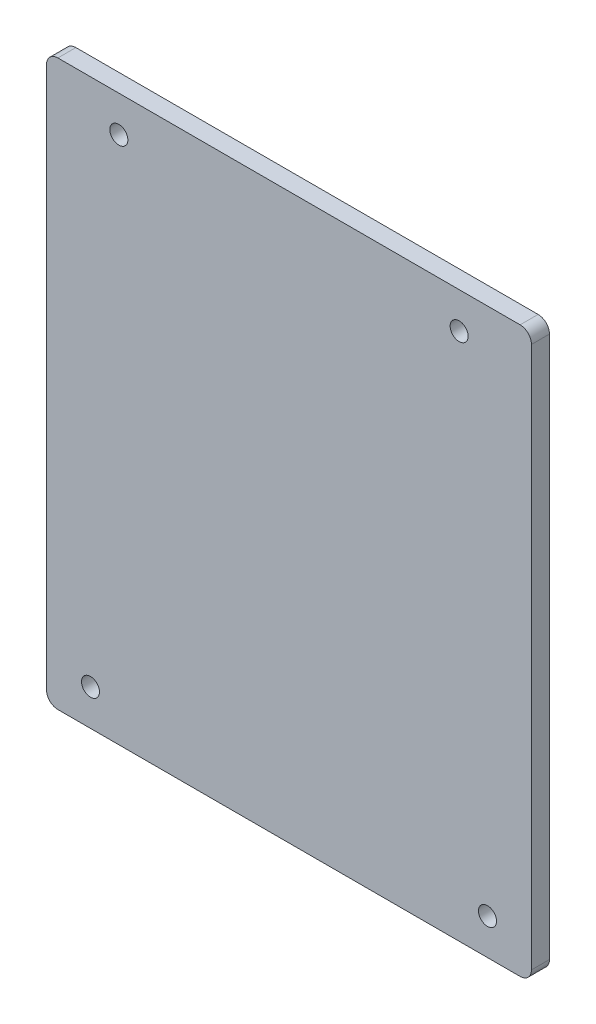
ISO-10303-21;
HEADER;
FILE_DESCRIPTION(('STEP AP214'),'2;1');
FILE_NAME('part.step','',(''),(''),'','','');
FILE_SCHEMA(('AUTOMOTIVE_DESIGN { 1 0 10303 214 1 1 1 1 }'));
ENDSEC;
DATA;
#1=APPLICATION_CONTEXT('core data for automotive mechanical design processes');
#2=APPLICATION_PROTOCOL_DEFINITION('international standard','automotive_design',2000,#1);
#3=PRODUCT_CONTEXT('',#1,'mechanical');
#4=PRODUCT('Part','Part','',(#3));
#5=PRODUCT_RELATED_PRODUCT_CATEGORY('part','',(#4));
#6=PRODUCT_DEFINITION_FORMATION('','',#4);
#7=PRODUCT_DEFINITION_CONTEXT('part definition',#1,'design');
#8=PRODUCT_DEFINITION('design','',#6,#7);
#9=PRODUCT_DEFINITION_SHAPE('','',#8);
#10=(LENGTH_UNIT() NAMED_UNIT(*) SI_UNIT(.MILLI.,.METRE.));
#11=(NAMED_UNIT(*) PLANE_ANGLE_UNIT() SI_UNIT($,.RADIAN.));
#12=(NAMED_UNIT(*) SI_UNIT($,.STERADIAN.) SOLID_ANGLE_UNIT());
#13=UNCERTAINTY_MEASURE_WITH_UNIT(LENGTH_MEASURE(1.E-05),#10,'distance_accuracy_value','');
#14=(GEOMETRIC_REPRESENTATION_CONTEXT(3) GLOBAL_UNCERTAINTY_ASSIGNED_CONTEXT((#13)) GLOBAL_UNIT_ASSIGNED_CONTEXT((#10,
#11,#12)) REPRESENTATION_CONTEXT('',''));
#15=CARTESIAN_POINT('',(0.,0.,0.));
#16=DIRECTION('',(0.,0.,1.));
#17=DIRECTION('',(1.,0.,0.));
#18=AXIS2_PLACEMENT_3D('',#15,#16,#17);
#19=CARTESIAN_POINT('',(40.75,-97.5,3.175));
#20=DIRECTION('',(0.,0.,1.));
#21=DIRECTION('',(1.,0.,0.));
#22=AXIS2_PLACEMENT_3D('',#19,#20,#21);
#23=PLANE('',#22);
#24=CARTESIAN_POINT('',(35.,-93.15,3.175));
#25=DIRECTION('',(0.,0.,1.));
#26=DIRECTION('',(1.,0.,0.));
#27=AXIS2_PLACEMENT_3D('',#24,#25,#26);
#28=CIRCLE('',#27,1.5875);
#29=CARTESIAN_POINT('',(36.5875,-93.15,3.175));
#30=VERTEX_POINT('',#29);
#31=EDGE_CURVE('E188',#30,#30,#28,.T.);
#32=ORIENTED_EDGE('',*,*,#31,.F.);
#33=EDGE_LOOP('',(#32));
#34=FACE_BOUND('',#33,.T.);
#35=CARTESIAN_POINT('',(-30.,-6.35,3.175));
#36=DIRECTION('',(0.,0.,1.));
#37=DIRECTION('',(1.,0.,0.));
#38=AXIS2_PLACEMENT_3D('',#35,#36,#37);
#39=CIRCLE('',#38,1.5875);
#40=CARTESIAN_POINT('',(-28.4125,-6.35,3.175));
#41=VERTEX_POINT('',#40);
#42=EDGE_CURVE('E134',#41,#41,#39,.T.);
#43=ORIENTED_EDGE('',*,*,#42,.F.);
#44=EDGE_LOOP('',(#43));
#45=FACE_BOUND('',#44,.T.);
#46=CARTESIAN_POINT('',(40.75,-97.5,3.175));
#47=DIRECTION('',(0.,0.,1.));
#48=DIRECTION('',(1.,0.,0.));
#49=AXIS2_PLACEMENT_3D('',#46,#47,#48);
#50=CIRCLE('',#49,1.99999999999999);
#51=CARTESIAN_POINT('',(40.75,-99.5,3.175));
#52=VERTEX_POINT('',#51);
#53=CARTESIAN_POINT('',(42.75,-97.5,3.175));
#54=VERTEX_POINT('',#53);
#55=EDGE_CURVE('E145',#52,#54,#50,.T.);
#56=ORIENTED_EDGE('',*,*,#55,.T.);
#57=DIRECTION('',(0.,1.,0.));
#58=VECTOR('',#57,1.);
#59=CARTESIAN_POINT('',(42.75,-2.,3.175));
#60=LINE('',#59,#58);
#61=CARTESIAN_POINT('',(42.75,-2.,3.175));
#62=VERTEX_POINT('',#61);
#63=EDGE_CURVE('E93',#54,#62,#60,.T.);
#64=ORIENTED_EDGE('',*,*,#63,.T.);
#65=CARTESIAN_POINT('',(40.75,-2.,3.175));
#66=DIRECTION('',(0.,0.,1.));
#67=DIRECTION('',(-1.,0.,0.));
#68=AXIS2_PLACEMENT_3D('',#65,#66,#67);
#69=CIRCLE('',#68,2.);
#70=CARTESIAN_POINT('',(40.75,0.,3.175));
#71=VERTEX_POINT('',#70);
#72=EDGE_CURVE('E160',#62,#71,#69,.T.);
#73=ORIENTED_EDGE('',*,*,#72,.T.);
#74=DIRECTION('',(-1.,0.,0.));
#75=VECTOR('',#74,1.);
#76=CARTESIAN_POINT('',(-40.75,0.,3.175));
#77=LINE('',#76,#75);
#78=CARTESIAN_POINT('',(-40.75,0.,3.175));
#79=VERTEX_POINT('',#78);
#80=EDGE_CURVE('E173',#71,#79,#77,.T.);
#81=ORIENTED_EDGE('',*,*,#80,.T.);
#82=CARTESIAN_POINT('',(-40.75,-2.,3.175));
#83=DIRECTION('',(0.,0.,1.));
#84=DIRECTION('',(1.,0.,0.));
#85=AXIS2_PLACEMENT_3D('',#82,#83,#84);
#86=CIRCLE('',#85,2.);
#87=CARTESIAN_POINT('',(-42.75,-2.,3.175));
#88=VERTEX_POINT('',#87);
#89=EDGE_CURVE('E112',#79,#88,#86,.T.);
#90=ORIENTED_EDGE('',*,*,#89,.T.);
#91=DIRECTION('',(0.,-1.,0.));
#92=VECTOR('',#91,1.);
#93=CARTESIAN_POINT('',(-42.75,-2.,3.175));
#94=LINE('',#93,#92);
#95=CARTESIAN_POINT('',(-42.75,-97.5,3.175));
#96=VERTEX_POINT('',#95);
#97=EDGE_CURVE('E106',#88,#96,#94,.T.);
#98=ORIENTED_EDGE('',*,*,#97,.T.);
#99=CARTESIAN_POINT('',(-40.75,-97.5,3.175));
#100=DIRECTION('',(0.,0.,1.));
#101=DIRECTION('',(1.,0.,0.));
#102=AXIS2_PLACEMENT_3D('',#99,#100,#101);
#103=CIRCLE('',#102,1.99999999999999);
#104=CARTESIAN_POINT('',(-40.75,-99.5,3.175));
#105=VERTEX_POINT('',#104);
#106=EDGE_CURVE('E110',#96,#105,#103,.T.);
#107=ORIENTED_EDGE('',*,*,#106,.T.);
#108=DIRECTION('',(1.,0.,0.));
#109=VECTOR('',#108,1.);
#110=CARTESIAN_POINT('',(-40.75,-99.5,3.175));
#111=LINE('',#110,#109);
#112=EDGE_CURVE('E50',#105,#52,#111,.T.);
#113=ORIENTED_EDGE('',*,*,#112,.T.);
#114=EDGE_LOOP('',(#56,#64,#73,#81,#90,#98,#107,#113));
#115=FACE_BOUND('',#114,.T.);
#116=CARTESIAN_POINT('',(30.,-6.35,3.175));
#117=DIRECTION('',(0.,0.,1.));
#118=DIRECTION('',(1.,0.,0.));
#119=AXIS2_PLACEMENT_3D('',#116,#117,#118);
#120=CIRCLE('',#119,1.5875);
#121=CARTESIAN_POINT('',(31.5875,-6.35,3.175));
#122=VERTEX_POINT('',#121);
#123=EDGE_CURVE('E182',#122,#122,#120,.T.);
#124=ORIENTED_EDGE('',*,*,#123,.F.);
#125=EDGE_LOOP('',(#124));
#126=FACE_BOUND('',#125,.T.);
#127=CARTESIAN_POINT('',(-35.,-93.15,3.175));
#128=DIRECTION('',(0.,0.,1.));
#129=DIRECTION('',(1.,0.,0.));
#130=AXIS2_PLACEMENT_3D('',#127,#128,#129);
#131=CIRCLE('',#130,1.5875);
#132=CARTESIAN_POINT('',(-33.4125,-93.15,3.175));
#133=VERTEX_POINT('',#132);
#134=EDGE_CURVE('E194',#133,#133,#131,.T.);
#135=ORIENTED_EDGE('',*,*,#134,.F.);
#136=EDGE_LOOP('',(#135));
#137=FACE_BOUND('',#136,.T.);
#138=ADVANCED_FACE('F33',(#34,#45,#115,#126,#137),#23,.T.);
#139=CARTESIAN_POINT('',(40.75,-97.5,0.));
#140=DIRECTION('',(0.,0.,1.));
#141=DIRECTION('',(1.,0.,0.));
#142=AXIS2_PLACEMENT_3D('',#139,#140,#141);
#143=PLANE('',#142);
#144=CARTESIAN_POINT('',(40.75,-97.5,0.));
#145=DIRECTION('',(0.,0.,1.));
#146=DIRECTION('',(1.,0.,0.));
#147=AXIS2_PLACEMENT_3D('',#144,#145,#146);
#148=CIRCLE('',#147,1.99999999999999);
#149=CARTESIAN_POINT('',(40.75,-99.5,0.));
#150=VERTEX_POINT('',#149);
#151=CARTESIAN_POINT('',(42.75,-97.5,0.));
#152=VERTEX_POINT('',#151);
#153=EDGE_CURVE('E130',#150,#152,#148,.T.);
#154=ORIENTED_EDGE('',*,*,#153,.F.);
#155=DIRECTION('',(1.,0.,0.));
#156=VECTOR('',#155,1.);
#157=CARTESIAN_POINT('',(-40.75,-99.5,0.));
#158=LINE('',#157,#156);
#159=CARTESIAN_POINT('',(-40.75,-99.5,0.));
#160=VERTEX_POINT('',#159);
#161=EDGE_CURVE('E85',#160,#150,#158,.T.);
#162=ORIENTED_EDGE('',*,*,#161,.F.);
#163=CARTESIAN_POINT('',(-40.75,-97.5,0.));
#164=DIRECTION('',(0.,0.,1.));
#165=DIRECTION('',(1.,0.,0.));
#166=AXIS2_PLACEMENT_3D('',#163,#164,#165);
#167=CIRCLE('',#166,1.99999999999999);
#168=CARTESIAN_POINT('',(-42.75,-97.5,0.));
#169=VERTEX_POINT('',#168);
#170=EDGE_CURVE('E79',#169,#160,#167,.T.);
#171=ORIENTED_EDGE('',*,*,#170,.F.);
#172=DIRECTION('',(0.,-1.,0.));
#173=VECTOR('',#172,1.);
#174=CARTESIAN_POINT('',(-42.75,-2.,0.));
#175=LINE('',#174,#173);
#176=CARTESIAN_POINT('',(-42.75,-2.,0.));
#177=VERTEX_POINT('',#176);
#178=EDGE_CURVE('E120',#177,#169,#175,.T.);
#179=ORIENTED_EDGE('',*,*,#178,.F.);
#180=CARTESIAN_POINT('',(-40.75,-2.,0.));
#181=DIRECTION('',(0.,0.,1.));
#182=DIRECTION('',(1.,0.,0.));
#183=AXIS2_PLACEMENT_3D('',#180,#181,#182);
#184=CIRCLE('',#183,2.);
#185=CARTESIAN_POINT('',(-40.75,0.,0.));
#186=VERTEX_POINT('',#185);
#187=EDGE_CURVE('E140',#186,#177,#184,.T.);
#188=ORIENTED_EDGE('',*,*,#187,.F.);
#189=DIRECTION('',(-1.,0.,0.));
#190=VECTOR('',#189,1.);
#191=CARTESIAN_POINT('',(-40.75,0.,0.));
#192=LINE('',#191,#190);
#193=CARTESIAN_POINT('',(40.75,0.,0.));
#194=VERTEX_POINT('',#193);
#195=EDGE_CURVE('E138',#194,#186,#192,.T.);
#196=ORIENTED_EDGE('',*,*,#195,.F.);
#197=CARTESIAN_POINT('',(40.75,-2.,0.));
#198=DIRECTION('',(0.,0.,1.));
#199=DIRECTION('',(-1.,0.,0.));
#200=AXIS2_PLACEMENT_3D('',#197,#198,#199);
#201=CIRCLE('',#200,2.);
#202=CARTESIAN_POINT('',(42.75,-2.,0.));
#203=VERTEX_POINT('',#202);
#204=EDGE_CURVE('E136',#203,#194,#201,.T.);
#205=ORIENTED_EDGE('',*,*,#204,.F.);
#206=DIRECTION('',(0.,1.,0.));
#207=VECTOR('',#206,1.);
#208=CARTESIAN_POINT('',(42.75,-2.,0.));
#209=LINE('',#208,#207);
#210=EDGE_CURVE('E133',#152,#203,#209,.T.);
#211=ORIENTED_EDGE('',*,*,#210,.F.);
#212=EDGE_LOOP('',(#154,#162,#171,#179,#188,#196,#205,#211));
#213=FACE_BOUND('',#212,.T.);
#214=CARTESIAN_POINT('',(-30.,-6.35,0.));
#215=DIRECTION('',(0.,0.,1.));
#216=DIRECTION('',(1.,0.,0.));
#217=AXIS2_PLACEMENT_3D('',#214,#215,#216);
#218=CIRCLE('',#217,1.5875);
#219=CARTESIAN_POINT('',(-28.4125,-6.35,0.));
#220=VERTEX_POINT('',#219);
#221=EDGE_CURVE('E179',#220,#220,#218,.T.);
#222=ORIENTED_EDGE('',*,*,#221,.T.);
#223=EDGE_LOOP('',(#222));
#224=FACE_BOUND('',#223,.T.);
#225=CARTESIAN_POINT('',(30.,-6.35,0.));
#226=DIRECTION('',(0.,0.,1.));
#227=DIRECTION('',(1.,0.,0.));
#228=AXIS2_PLACEMENT_3D('',#225,#226,#227);
#229=CIRCLE('',#228,1.5875);
#230=CARTESIAN_POINT('',(31.5875,-6.35,0.));
#231=VERTEX_POINT('',#230);
#232=EDGE_CURVE('E185',#231,#231,#229,.T.);
#233=ORIENTED_EDGE('',*,*,#232,.T.);
#234=EDGE_LOOP('',(#233));
#235=FACE_BOUND('',#234,.T.);
#236=CARTESIAN_POINT('',(35.,-93.15,0.));
#237=DIRECTION('',(0.,0.,1.));
#238=DIRECTION('',(1.,0.,0.));
#239=AXIS2_PLACEMENT_3D('',#236,#237,#238);
#240=CIRCLE('',#239,1.5875);
#241=CARTESIAN_POINT('',(36.5875,-93.15,0.));
#242=VERTEX_POINT('',#241);
#243=EDGE_CURVE('E191',#242,#242,#240,.T.);
#244=ORIENTED_EDGE('',*,*,#243,.T.);
#245=EDGE_LOOP('',(#244));
#246=FACE_BOUND('',#245,.T.);
#247=CARTESIAN_POINT('',(-35.,-93.15,0.));
#248=DIRECTION('',(0.,0.,1.));
#249=DIRECTION('',(1.,0.,0.));
#250=AXIS2_PLACEMENT_3D('',#247,#248,#249);
#251=CIRCLE('',#250,1.5875);
#252=CARTESIAN_POINT('',(-33.4125,-93.15,0.));
#253=VERTEX_POINT('',#252);
#254=EDGE_CURVE('E197',#253,#253,#251,.T.);
#255=ORIENTED_EDGE('',*,*,#254,.T.);
#256=EDGE_LOOP('',(#255));
#257=FACE_BOUND('',#256,.T.);
#258=ADVANCED_FACE('F164',(#213,#224,#235,#246,#257),#143,.F.);
#259=CARTESIAN_POINT('',(40.75,-97.5,3.175));
#260=DIRECTION('',(0.,0.,-1.));
#261=DIRECTION('',(-1.,0.,0.));
#262=AXIS2_PLACEMENT_3D('',#259,#260,#261);
#263=CYLINDRICAL_SURFACE('',#262,1.99999999999999);
#264=ORIENTED_EDGE('',*,*,#153,.T.);
#265=DIRECTION('',(0.,0.,-1.));
#266=VECTOR('',#265,1.);
#267=CARTESIAN_POINT('',(42.75,-97.5,3.175));
#268=LINE('',#267,#266);
#269=EDGE_CURVE('E11',#54,#152,#268,.T.);
#270=ORIENTED_EDGE('',*,*,#269,.F.);
#271=ORIENTED_EDGE('',*,*,#55,.F.);
#272=DIRECTION('',(0.,0.,-1.));
#273=VECTOR('',#272,1.);
#274=CARTESIAN_POINT('',(40.75,-99.5,3.175));
#275=LINE('',#274,#273);
#276=EDGE_CURVE('E126',#52,#150,#275,.T.);
#277=ORIENTED_EDGE('',*,*,#276,.T.);
#278=EDGE_LOOP('',(#264,#270,#271,#277));
#279=FACE_BOUND('',#278,.T.);
#280=ADVANCED_FACE('F35',(#279),#263,.T.);
#281=CARTESIAN_POINT('',(42.75,-2.,3.175));
#282=DIRECTION('',(-1.,0.,0.));
#283=DIRECTION('',(0.,-1.,0.));
#284=AXIS2_PLACEMENT_3D('',#281,#282,#283);
#285=PLANE('',#284);
#286=ORIENTED_EDGE('',*,*,#210,.T.);
#287=DIRECTION('',(0.,0.,-1.));
#288=VECTOR('',#287,1.);
#289=CARTESIAN_POINT('',(42.75,-2.,3.175));
#290=LINE('',#289,#288);
#291=EDGE_CURVE('E42',#62,#203,#290,.T.);
#292=ORIENTED_EDGE('',*,*,#291,.F.);
#293=ORIENTED_EDGE('',*,*,#63,.F.);
#294=ORIENTED_EDGE('',*,*,#269,.T.);
#295=EDGE_LOOP('',(#286,#292,#293,#294));
#296=FACE_BOUND('',#295,.T.);
#297=ADVANCED_FACE('F231',(#296),#285,.F.);
#298=CARTESIAN_POINT('',(40.75,-2.,3.175));
#299=DIRECTION('',(0.,0.,-1.));
#300=DIRECTION('',(-1.,0.,0.));
#301=AXIS2_PLACEMENT_3D('',#298,#299,#300);
#302=CYLINDRICAL_SURFACE('',#301,2.);
#303=ORIENTED_EDGE('',*,*,#204,.T.);
#304=DIRECTION('',(0.,0.,-1.));
#305=VECTOR('',#304,1.);
#306=CARTESIAN_POINT('',(40.75,0.,3.175));
#307=LINE('',#306,#305);
#308=EDGE_CURVE('E152',#71,#194,#307,.T.);
#309=ORIENTED_EDGE('',*,*,#308,.F.);
#310=ORIENTED_EDGE('',*,*,#72,.F.);
#311=ORIENTED_EDGE('',*,*,#291,.T.);
#312=EDGE_LOOP('',(#303,#309,#310,#311));
#313=FACE_BOUND('',#312,.T.);
#314=ADVANCED_FACE('F158',(#313),#302,.T.);
#315=CARTESIAN_POINT('',(-40.75,0.,3.175));
#316=DIRECTION('',(0.,-1.,0.));
#317=DIRECTION('',(0.,0.,-1.));
#318=AXIS2_PLACEMENT_3D('',#315,#316,#317);
#319=PLANE('',#318);
#320=ORIENTED_EDGE('',*,*,#195,.T.);
#321=DIRECTION('',(0.,0.,-1.));
#322=VECTOR('',#321,1.);
#323=CARTESIAN_POINT('',(-40.75,0.,3.175));
#324=LINE('',#323,#322);
#325=EDGE_CURVE('E149',#79,#186,#324,.T.);
#326=ORIENTED_EDGE('',*,*,#325,.F.);
#327=ORIENTED_EDGE('',*,*,#80,.F.);
#328=ORIENTED_EDGE('',*,*,#308,.T.);
#329=EDGE_LOOP('',(#320,#326,#327,#328));
#330=FACE_BOUND('',#329,.T.);
#331=ADVANCED_FACE('F169',(#330),#319,.F.);
#332=CARTESIAN_POINT('',(-40.75,-2.,3.175));
#333=DIRECTION('',(0.,0.,-1.));
#334=DIRECTION('',(-1.,0.,0.));
#335=AXIS2_PLACEMENT_3D('',#332,#333,#334);
#336=CYLINDRICAL_SURFACE('',#335,2.);
#337=ORIENTED_EDGE('',*,*,#187,.T.);
#338=DIRECTION('',(0.,0.,-1.));
#339=VECTOR('',#338,1.);
#340=CARTESIAN_POINT('',(-42.75,-2.,3.175));
#341=LINE('',#340,#339);
#342=EDGE_CURVE('E121',#88,#177,#341,.T.);
#343=ORIENTED_EDGE('',*,*,#342,.F.);
#344=ORIENTED_EDGE('',*,*,#89,.F.);
#345=ORIENTED_EDGE('',*,*,#325,.T.);
#346=EDGE_LOOP('',(#337,#343,#344,#345));
#347=FACE_BOUND('',#346,.T.);
#348=ADVANCED_FACE('F172',(#347),#336,.T.);
#349=CARTESIAN_POINT('',(-42.75,-2.,3.175));
#350=DIRECTION('',(1.,0.,0.));
#351=DIRECTION('',(0.,1.,0.));
#352=AXIS2_PLACEMENT_3D('',#349,#350,#351);
#353=PLANE('',#352);
#354=ORIENTED_EDGE('',*,*,#178,.T.);
#355=DIRECTION('',(0.,0.,-1.));
#356=VECTOR('',#355,1.);
#357=CARTESIAN_POINT('',(-42.75,-97.5,3.175));
#358=LINE('',#357,#356);
#359=EDGE_CURVE('E117',#96,#169,#358,.T.);
#360=ORIENTED_EDGE('',*,*,#359,.F.);
#361=ORIENTED_EDGE('',*,*,#97,.F.);
#362=ORIENTED_EDGE('',*,*,#342,.T.);
#363=EDGE_LOOP('',(#354,#360,#361,#362));
#364=FACE_BOUND('',#363,.T.);
#365=ADVANCED_FACE('F118',(#364),#353,.F.);
#366=CARTESIAN_POINT('',(-40.75,-97.5,3.175));
#367=DIRECTION('',(0.,0.,-1.));
#368=DIRECTION('',(-1.,0.,0.));
#369=AXIS2_PLACEMENT_3D('',#366,#367,#368);
#370=CYLINDRICAL_SURFACE('',#369,1.99999999999999);
#371=ORIENTED_EDGE('',*,*,#170,.T.);
#372=DIRECTION('',(0.,0.,-1.));
#373=VECTOR('',#372,1.);
#374=CARTESIAN_POINT('',(-40.75,-99.5,3.175));
#375=LINE('',#374,#373);
#376=EDGE_CURVE('E122',#105,#160,#375,.T.);
#377=ORIENTED_EDGE('',*,*,#376,.F.);
#378=ORIENTED_EDGE('',*,*,#106,.F.);
#379=ORIENTED_EDGE('',*,*,#359,.T.);
#380=EDGE_LOOP('',(#371,#377,#378,#379));
#381=FACE_BOUND('',#380,.T.);
#382=ADVANCED_FACE('F124',(#381),#370,.T.);
#383=CARTESIAN_POINT('',(-40.75,-99.5,3.175));
#384=DIRECTION('',(0.,1.,0.));
#385=DIRECTION('',(0.,0.,1.));
#386=AXIS2_PLACEMENT_3D('',#383,#384,#385);
#387=PLANE('',#386);
#388=ORIENTED_EDGE('',*,*,#161,.T.);
#389=ORIENTED_EDGE('',*,*,#276,.F.);
#390=ORIENTED_EDGE('',*,*,#112,.F.);
#391=ORIENTED_EDGE('',*,*,#376,.T.);
#392=EDGE_LOOP('',(#388,#389,#390,#391));
#393=FACE_BOUND('',#392,.T.);
#394=ADVANCED_FACE('F219',(#393),#387,.F.);
#395=CARTESIAN_POINT('',(-30.,-6.35,3.175));
#396=DIRECTION('',(0.,0.,-1.));
#397=DIRECTION('',(-1.,0.,0.));
#398=AXIS2_PLACEMENT_3D('',#395,#396,#397);
#399=CYLINDRICAL_SURFACE('',#398,1.5875);
#400=ORIENTED_EDGE('',*,*,#42,.T.);
#401=EDGE_LOOP('',(#400));
#402=FACE_BOUND('',#401,.T.);
#403=ORIENTED_EDGE('',*,*,#221,.F.);
#404=EDGE_LOOP('',(#403));
#405=FACE_BOUND('',#404,.T.);
#406=ADVANCED_FACE('F216',(#402,#405),#399,.F.);
#407=CARTESIAN_POINT('',(30.,-6.35,3.175));
#408=DIRECTION('',(0.,0.,-1.));
#409=DIRECTION('',(-1.,0.,0.));
#410=AXIS2_PLACEMENT_3D('',#407,#408,#409);
#411=CYLINDRICAL_SURFACE('',#410,1.5875);
#412=ORIENTED_EDGE('',*,*,#123,.T.);
#413=EDGE_LOOP('',(#412));
#414=FACE_BOUND('',#413,.T.);
#415=ORIENTED_EDGE('',*,*,#232,.F.);
#416=EDGE_LOOP('',(#415));
#417=FACE_BOUND('',#416,.T.);
#418=ADVANCED_FACE('F295',(#414,#417),#411,.F.);
#419=CARTESIAN_POINT('',(35.,-93.15,3.175));
#420=DIRECTION('',(0.,0.,-1.));
#421=DIRECTION('',(-1.,0.,0.));
#422=AXIS2_PLACEMENT_3D('',#419,#420,#421);
#423=CYLINDRICAL_SURFACE('',#422,1.5875);
#424=ORIENTED_EDGE('',*,*,#31,.T.);
#425=EDGE_LOOP('',(#424));
#426=FACE_BOUND('',#425,.T.);
#427=ORIENTED_EDGE('',*,*,#243,.F.);
#428=EDGE_LOOP('',(#427));
#429=FACE_BOUND('',#428,.T.);
#430=ADVANCED_FACE('F303',(#426,#429),#423,.F.);
#431=CARTESIAN_POINT('',(-35.,-93.15,3.175));
#432=DIRECTION('',(0.,0.,-1.));
#433=DIRECTION('',(-1.,0.,0.));
#434=AXIS2_PLACEMENT_3D('',#431,#432,#433);
#435=CYLINDRICAL_SURFACE('',#434,1.5875);
#436=ORIENTED_EDGE('',*,*,#134,.T.);
#437=EDGE_LOOP('',(#436));
#438=FACE_BOUND('',#437,.T.);
#439=ORIENTED_EDGE('',*,*,#254,.F.);
#440=EDGE_LOOP('',(#439));
#441=FACE_BOUND('',#440,.T.);
#442=ADVANCED_FACE('F203',(#438,#441),#435,.F.);
#443=CLOSED_SHELL('',(#138,#258,#280,#297,#314,#331,#348,#365,#382,#394,#406,#418,#430,#442));
#444=MANIFOLD_SOLID_BREP('B2',#443);
#445=ADVANCED_BREP_SHAPE_REPRESENTATION('',(#18,#444),#14);
#446=SHAPE_DEFINITION_REPRESENTATION(#9,#445);
ENDSEC;
END-ISO-10303-21;
